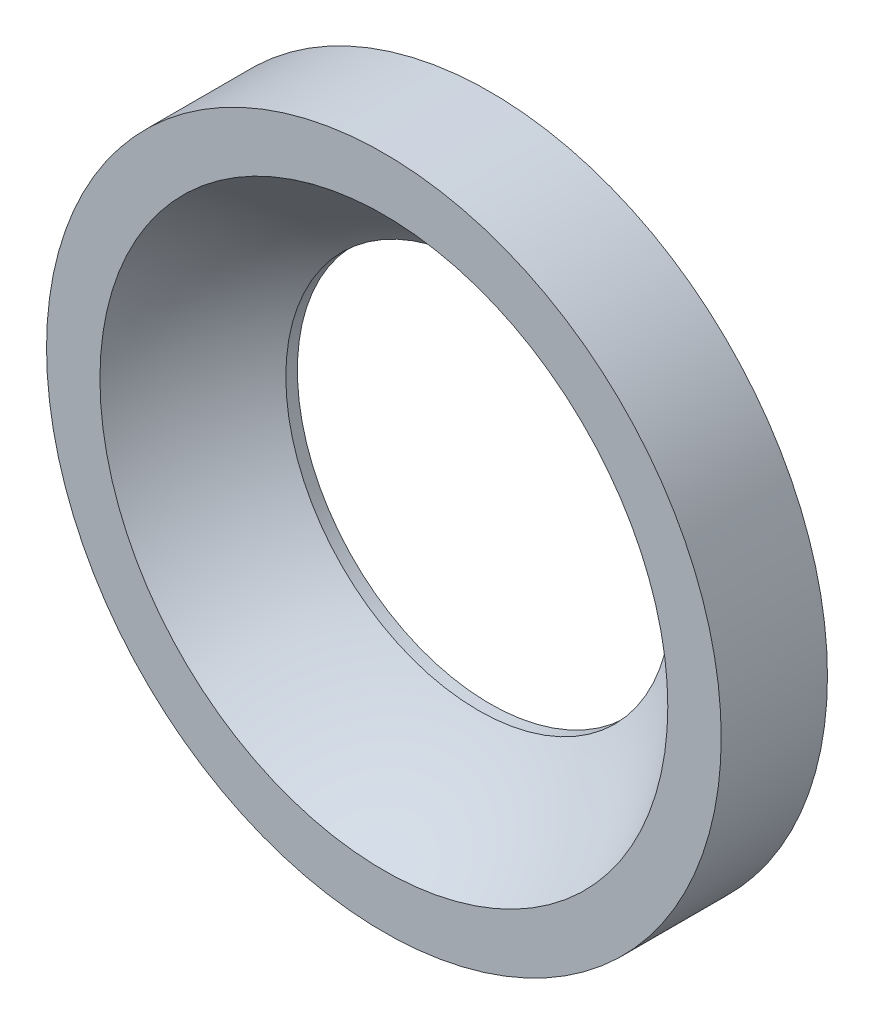
ISO-10303-21;
HEADER;
FILE_DESCRIPTION(('STEP AP214'),'2;1');
FILE_NAME('part.step','',(''),(''),'','','');
FILE_SCHEMA(('AUTOMOTIVE_DESIGN { 1 0 10303 214 1 1 1 1 }'));
ENDSEC;
DATA;
#1=APPLICATION_CONTEXT('core data for automotive mechanical design processes');
#2=APPLICATION_PROTOCOL_DEFINITION('international standard','automotive_design',2000,#1);
#3=PRODUCT_CONTEXT('',#1,'mechanical');
#4=PRODUCT('Part','Part','',(#3));
#5=PRODUCT_RELATED_PRODUCT_CATEGORY('part','',(#4));
#6=PRODUCT_DEFINITION_FORMATION('','',#4);
#7=PRODUCT_DEFINITION_CONTEXT('part definition',#1,'design');
#8=PRODUCT_DEFINITION('design','',#6,#7);
#9=PRODUCT_DEFINITION_SHAPE('','',#8);
#10=(LENGTH_UNIT() NAMED_UNIT(*) SI_UNIT(.MILLI.,.METRE.));
#11=(NAMED_UNIT(*) PLANE_ANGLE_UNIT() SI_UNIT($,.RADIAN.));
#12=(NAMED_UNIT(*) SI_UNIT($,.STERADIAN.) SOLID_ANGLE_UNIT());
#13=UNCERTAINTY_MEASURE_WITH_UNIT(LENGTH_MEASURE(1.E-05),#10,'distance_accuracy_value','');
#14=(GEOMETRIC_REPRESENTATION_CONTEXT(3) GLOBAL_UNCERTAINTY_ASSIGNED_CONTEXT((#13)) GLOBAL_UNIT_ASSIGNED_CONTEXT((#10,
#11,#12)) REPRESENTATION_CONTEXT('',''));
#15=CARTESIAN_POINT('',(0.,0.,0.));
#16=DIRECTION('',(0.,0.,1.));
#17=DIRECTION('',(1.,0.,0.));
#18=AXIS2_PLACEMENT_3D('',#15,#16,#17);
#19=CARTESIAN_POINT('',(0.,0.,7.));
#20=DIRECTION('',(0.,0.,-1.));
#21=DIRECTION('',(-1.,0.,0.));
#22=AXIS2_PLACEMENT_3D('',#19,#20,#21);
#23=CYLINDRICAL_SURFACE('',#22,22.225);
#24=CARTESIAN_POINT('',(0.,0.,7.));
#25=DIRECTION('',(0.,0.,1.));
#26=DIRECTION('',(1.,0.,0.));
#27=AXIS2_PLACEMENT_3D('',#24,#25,#26);
#28=CIRCLE('',#27,22.225);
#29=CARTESIAN_POINT('',(22.225,0.,7.));
#30=VERTEX_POINT('',#29);
#31=EDGE_CURVE('E10',#30,#30,#28,.T.);
#32=ORIENTED_EDGE('',*,*,#31,.F.);
#33=EDGE_LOOP('',(#32));
#34=FACE_BOUND('',#33,.T.);
#35=CARTESIAN_POINT('',(0.,0.,0.));
#36=DIRECTION('',(0.,0.,1.));
#37=DIRECTION('',(1.,0.,0.));
#38=AXIS2_PLACEMENT_3D('',#35,#36,#37);
#39=CIRCLE('',#38,22.225);
#40=CARTESIAN_POINT('',(22.225,0.,0.));
#41=VERTEX_POINT('',#40);
#42=EDGE_CURVE('E46',#41,#41,#39,.T.);
#43=ORIENTED_EDGE('',*,*,#42,.T.);
#44=EDGE_LOOP('',(#43));
#45=FACE_BOUND('',#44,.T.);
#46=ADVANCED_FACE('F43',(#34,#45),#23,.T.);
#47=CARTESIAN_POINT('',(0.,0.,7.));
#48=DIRECTION('',(0.,0.,1.));
#49=DIRECTION('',(1.,0.,0.));
#50=AXIS2_PLACEMENT_3D('',#47,#48,#49);
#51=PLANE('',#50);
#52=CARTESIAN_POINT('',(0.,0.,6.99999999999994));
#53=DIRECTION('',(0.,0.,-1.));
#54=DIRECTION('',(-1.,0.,0.));
#55=AXIS2_PLACEMENT_3D('',#52,#53,#54);
#56=CIRCLE('',#55,18.7069672849449);
#57=CARTESIAN_POINT('',(-18.7069672849449,0.,7.));
#58=VERTEX_POINT('',#57);
#59=EDGE_CURVE('E60',#58,#58,#56,.T.);
#60=ORIENTED_EDGE('',*,*,#59,.T.);
#61=EDGE_LOOP('',(#60));
#62=FACE_BOUND('',#61,.T.);
#63=ORIENTED_EDGE('',*,*,#31,.T.);
#64=EDGE_LOOP('',(#63));
#65=FACE_BOUND('',#64,.T.);
#66=ADVANCED_FACE('F80',(#62,#65),#51,.T.);
#67=CARTESIAN_POINT('',(0.,0.,0.));
#68=DIRECTION('',(0.,0.,1.));
#69=DIRECTION('',(1.,0.,0.));
#70=AXIS2_PLACEMENT_3D('',#67,#68,#69);
#71=PLANE('',#70);
#72=CARTESIAN_POINT('',(0.,0.,0.));
#73=DIRECTION('',(0.,0.,1.));
#74=DIRECTION('',(1.,0.,0.));
#75=AXIS2_PLACEMENT_3D('',#72,#73,#74);
#76=CIRCLE('',#75,12.7);
#77=CARTESIAN_POINT('',(12.7,0.,0.));
#78=VERTEX_POINT('',#77);
#79=EDGE_CURVE('E55',#78,#78,#76,.T.);
#80=ORIENTED_EDGE('',*,*,#79,.T.);
#81=EDGE_LOOP('',(#80));
#82=FACE_BOUND('',#81,.T.);
#83=ORIENTED_EDGE('',*,*,#42,.F.);
#84=EDGE_LOOP('',(#83));
#85=FACE_BOUND('',#84,.T.);
#86=ADVANCED_FACE('F74',(#82,#85),#71,.F.);
#87=CARTESIAN_POINT('',(0.,0.,0.));
#88=DIRECTION('',(0.,0.,1.));
#89=DIRECTION('',(1.,0.,0.));
#90=AXIS2_PLACEMENT_3D('',#87,#88,#89);
#91=CYLINDRICAL_SURFACE('',#90,12.7);
#92=CARTESIAN_POINT('',(0.,0.,0.761013597241716));
#93=DIRECTION('',(0.,0.,-1.));
#94=DIRECTION('',(-1.,0.,0.));
#95=AXIS2_PLACEMENT_3D('',#92,#93,#94);
#96=CIRCLE('',#95,12.7);
#97=CARTESIAN_POINT('',(-12.7,0.,0.761013597241761));
#98=VERTEX_POINT('',#97);
#99=EDGE_CURVE('E64',#98,#98,#96,.T.);
#100=ORIENTED_EDGE('',*,*,#99,.F.);
#101=EDGE_LOOP('',(#100));
#102=FACE_BOUND('',#101,.T.);
#103=ORIENTED_EDGE('',*,*,#79,.F.);
#104=EDGE_LOOP('',(#103));
#105=FACE_BOUND('',#104,.T.);
#106=ADVANCED_FACE('F71',(#102,#105),#91,.F.);
#107=CARTESIAN_POINT('',(0.,0.,19.));
#108=DIRECTION('',(0.,0.,-1.));
#109=DIRECTION('',(-1.,0.,0.));
#110=AXIS2_PLACEMENT_3D('',#107,#108,#109);
#111=SPHERICAL_SURFACE('',#110,22.225);
#112=CARTESIAN_POINT('',(-18.7069672849449,0.,7.));
#113=CARTESIAN_POINT('',(-18.6579430819419,0.,6.92357543093611));
#114=CARTESIAN_POINT('',(-18.6084504978296,0.,6.84745131610337));
#115=CARTESIAN_POINT('',(-18.5085361117011,0.,6.69581535689814));
#116=CARTESIAN_POINT('',(-18.4581143096851,0.,6.62030351252563));
#117=CARTESIAN_POINT('',(-18.3563490320643,0.,6.46990345623875));
#118=CARTESIAN_POINT('',(-18.3050055564596,0.,6.39501524432437));
#119=CARTESIAN_POINT('',(-18.2014046518198,0.,6.2458736966335));
#120=CARTESIAN_POINT('',(-18.1491472227848,0.,6.17162036085702));
#121=CARTESIAN_POINT('',(-18.0437262587057,0.,6.0237597203606));
#122=CARTESIAN_POINT('',(-17.9905627236616,0.,5.95015241564066));
#123=CARTESIAN_POINT('',(-17.883337533776,0.,5.80359489336702));
#124=CARTESIAN_POINT('',(-17.8292758789345,0.,5.73064467581331));
#125=CARTESIAN_POINT('',(-17.7202625698521,0.,5.58541228575542));
#126=CARTESIAN_POINT('',(-17.6653109156112,0.,5.51313011325124));
#127=CARTESIAN_POINT('',(-17.5545258620066,0.,5.36924467070227));
#128=CARTESIAN_POINT('',(-17.498692462643,0.,5.29764140065748));
#129=CARTESIAN_POINT('',(-17.3861523054641,0.,5.15512451849389));
#130=CARTESIAN_POINT('',(-17.3294455476489,0.,5.0842109063751));
#131=CARTESIAN_POINT('',(-17.2151671914383,0.,4.94308399192813));
#132=CARTESIAN_POINT('',(-17.1575955930428,0.,4.87287068959995));
#133=CARTESIAN_POINT('',(-17.0415962034462,0.,4.7331549414084));
#134=CARTESIAN_POINT('',(-16.9831684122451,0.,4.66365249554503));
#135=CARTESIAN_POINT('',(-16.8654654134204,0.,4.52536890017956));
#136=CARTESIAN_POINT('',(-16.8061902057969,0.,4.45658775067746));
#137=CARTESIAN_POINT('',(-16.6868012778004,0.,4.31975707958591));
#138=CARTESIAN_POINT('',(-16.6266875574274,0.,4.25170755799647));
#139=CARTESIAN_POINT('',(-16.5056306335569,0.,4.11635036438445));
#140=CARTESIAN_POINT('',(-16.4446874300594,0.,4.04904269236188));
#141=CARTESIAN_POINT('',(-16.3219806941607,0.,3.91517930810531));
#142=CARTESIAN_POINT('',(-16.2602171617596,0.,3.84862359587131));
#143=CARTESIAN_POINT('',(-16.1358790454955,0.,3.71627412846242));
#144=CARTESIAN_POINT('',(-16.0733044616326,0.,3.65048037328752));
#145=CARTESIAN_POINT('',(-15.9473536417138,0.,3.5196647028145));
#146=CARTESIAN_POINT('',(-15.883977405658,0.,3.45464278751639));
#147=CARTESIAN_POINT('',(-15.7564328010379,0.,3.32538056367729));
#148=CARTESIAN_POINT('',(-15.6922644324737,0.,3.2611402551363));
#149=CARTESIAN_POINT('',(-15.5631452015067,0.,3.13345089428739));
#150=CARTESIAN_POINT('',(-15.4981943391039,0.,3.07000184197947));
#151=CARTESIAN_POINT('',(-15.3675198766674,0.,2.94390452421876));
#152=CARTESIAN_POINT('',(-15.3017962766336,0.,2.88125625876599));
#153=CARTESIAN_POINT('',(-15.1695862112149,0.,2.75676992505223));
#154=CARTESIAN_POINT('',(-15.1030997458299,0.,2.69493185679125));
#155=CARTESIAN_POINT('',(-14.9693739365778,0.,2.57207520609875));
#156=CARTESIAN_POINT('',(-14.9021345927107,0.,2.51105662366722));
#157=CARTESIAN_POINT('',(-14.7669131264522,0.,2.38984811017731));
#158=CARTESIAN_POINT('',(-14.6989310040609,0.,2.32965817911894));
#159=CARTESIAN_POINT('',(-14.5622341922851,0.,2.21011600944714));
#160=CARTESIAN_POINT('',(-14.4935195029005,0.,2.15076377083372));
#161=CARTESIAN_POINT('',(-14.3553678787043,0.,2.03290590129827));
#162=CARTESIAN_POINT('',(-14.2859309438928,0.,1.97440027037624));
#163=CARTESIAN_POINT('',(-14.1463452589066,0.,1.85824440428836));
#164=CARTESIAN_POINT('',(-14.076196508732,0.,1.80059416912251));
#165=CARTESIAN_POINT('',(-13.9351977299687,0.,1.68615775417394));
#166=CARTESIAN_POINT('',(-13.86434770138,0.,1.62937157439122));
#167=CARTESIAN_POINT('',(-13.7219570082102,0.,1.51667179985909));
#168=CARTESIAN_POINT('',(-13.650416343629,0.,1.46075820510966));
#169=CARTESIAN_POINT('',(-13.5066551241345,0.,1.34981199992513));
#170=CARTESIAN_POINT('',(-13.4344345692212,0.,1.29477938949002));
#171=CARTESIAN_POINT('',(-13.2893244187184,0.,1.18560341726706));
#172=CARTESIAN_POINT('',(-13.2164348231288,0.,1.13146005547923));
#173=CARTESIAN_POINT('',(-13.0699975344471,0.,1.02407072107447));
#174=CARTESIAN_POINT('',(-12.996449841355,0.,0.970824748457542));
#175=CARTESIAN_POINT('',(-12.8487074257364,0.,0.865238161683038));
#176=CARTESIAN_POINT('',(-12.7745127032098,0.,0.812897547525457));
#177=CARTESIAN_POINT('',(-12.7,0.,0.761013597241761));
#178=B_SPLINE_CURVE_WITH_KNOTS('',3,(#112,#113,#114,#115,#116,#117,#118,#119,#120,#121,#122,
#123,#124,#125,#126,#127,#128,#129,#130,#131,#132,#133,#134,#135,#136,#137,#138,#139,#140,#141,
#142,#143,#144,#145,#146,#147,#148,#149,#150,#151,#152,#153,#154,#155,#156,#157,#158,#159,#160,
#161,#162,#163,#164,#165,#166,#167,#168,#169,#170,#171,#172,#173,#174,#175,#176,#177),
.UNSPECIFIED.,.F.,.F.,(4,2,2,2,2,2,2,2,2,2,2,2,2,2,2,2,2,2,2,2,2,2,2,2,2,2,2,2,2,2,2,2,4),(0.,
0.27238916239113,0.54477832478226,0.817167487173388,1.08955664956452,1.36194581195565,
1.63433497434678,1.90672413673791,2.17911329912904,2.45150246152017,2.72389162391129,
2.99628078630242,3.26866994869356,3.54105911108468,3.81344827347581,4.08583743586694,
4.35822659825808,4.6306157606492,4.90300492304033,5.17539408543146,5.44778324782259,
5.72017241021372,5.99256157260485,6.26495073499598,6.53733989738711,6.80972905977824,
7.08211822216937,7.3545073845605,7.62689654695163,7.89928570934276,8.17167487173389,
8.44406403412502,8.71645319651615),.UNSPECIFIED.);
#179=EDGE_CURVE('BSEAM69',#58,#98,#178,.T.);
#180=ORIENTED_EDGE('',*,*,#59,.F.);
#181=ORIENTED_EDGE('',*,*,#99,.T.);
#182=ORIENTED_EDGE('',*,*,#179,.T.);
#183=ORIENTED_EDGE('',*,*,#179,.F.);
#184=EDGE_LOOP('',(#180,#182,#181,#183));
#185=FACE_BOUND('',#184,.T.);
#186=ADVANCED_FACE('F69',(#185),#111,.F.);
#187=CLOSED_SHELL('',(#46,#66,#86,#106,#186));
#188=MANIFOLD_SOLID_BREP('B2',#187);
#189=ADVANCED_BREP_SHAPE_REPRESENTATION('',(#18,#188),#14);
#190=SHAPE_DEFINITION_REPRESENTATION(#9,#189);
ENDSEC;
END-ISO-10303-21;
